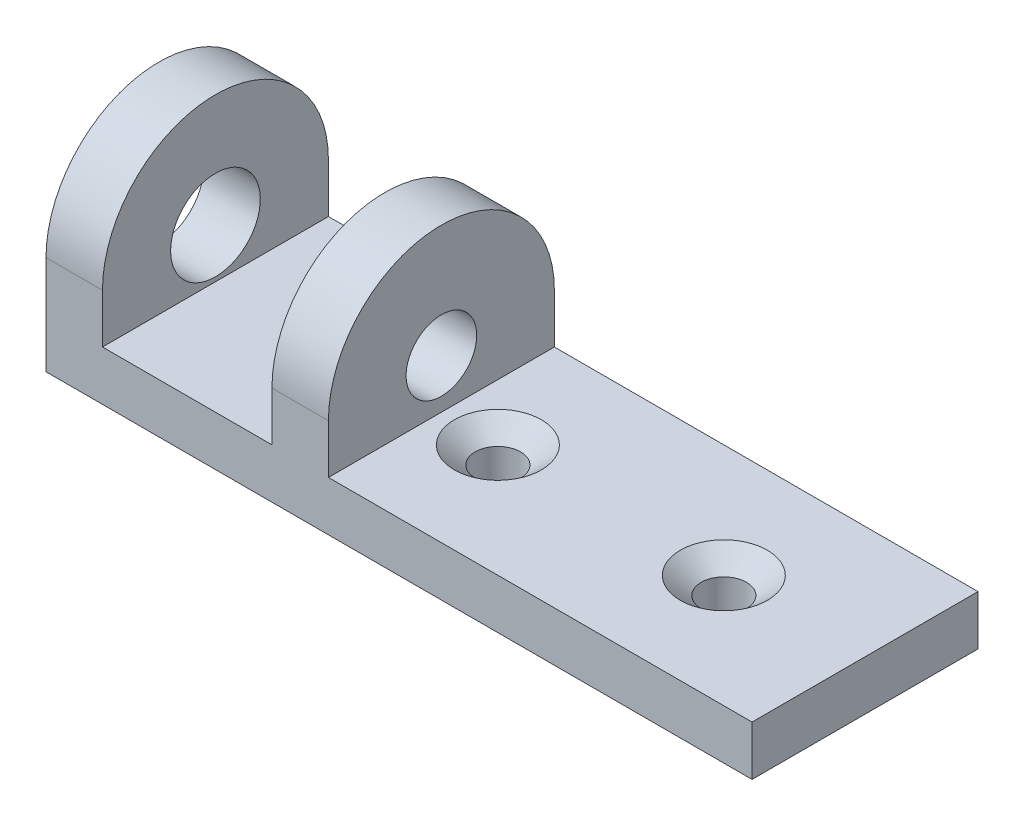
ISO-10303-21;
HEADER;
FILE_DESCRIPTION(('STEP AP214'),'2;1');
FILE_NAME('part.step','',(''),(''),'','','');
FILE_SCHEMA(('AUTOMOTIVE_DESIGN { 1 0 10303 214 1 1 1 1 }'));
ENDSEC;
DATA;
#1=APPLICATION_CONTEXT('core data for automotive mechanical design processes');
#2=APPLICATION_PROTOCOL_DEFINITION('international standard','automotive_design',2000,#1);
#3=PRODUCT_CONTEXT('',#1,'mechanical');
#4=PRODUCT('Part','Part','',(#3));
#5=PRODUCT_RELATED_PRODUCT_CATEGORY('part','',(#4));
#6=PRODUCT_DEFINITION_FORMATION('','',#4);
#7=PRODUCT_DEFINITION_CONTEXT('part definition',#1,'design');
#8=PRODUCT_DEFINITION('design','',#6,#7);
#9=PRODUCT_DEFINITION_SHAPE('','',#8);
#10=(LENGTH_UNIT() NAMED_UNIT(*) SI_UNIT(.MILLI.,.METRE.));
#11=(NAMED_UNIT(*) PLANE_ANGLE_UNIT() SI_UNIT($,.RADIAN.));
#12=(NAMED_UNIT(*) SI_UNIT($,.STERADIAN.) SOLID_ANGLE_UNIT());
#13=UNCERTAINTY_MEASURE_WITH_UNIT(LENGTH_MEASURE(1.E-05),#10,'distance_accuracy_value','');
#14=(GEOMETRIC_REPRESENTATION_CONTEXT(3) GLOBAL_UNCERTAINTY_ASSIGNED_CONTEXT((#13)) GLOBAL_UNIT_ASSIGNED_CONTEXT((#10,
#11,#12)) REPRESENTATION_CONTEXT('',''));
#15=CARTESIAN_POINT('',(0.,0.,0.));
#16=DIRECTION('',(0.,0.,1.));
#17=DIRECTION('',(1.,0.,0.));
#18=AXIS2_PLACEMENT_3D('',#15,#16,#17);
#19=CARTESIAN_POINT('',(6.34999999999999,12.7,-12.7));
#20=DIRECTION('',(-1.,0.,0.));
#21=DIRECTION('',(0.,-1.,0.));
#22=AXIS2_PLACEMENT_3D('',#19,#20,#21);
#23=PLANE('',#22);
#24=DIRECTION('',(0.,-1.,0.));
#25=VECTOR('',#24,1.);
#26=CARTESIAN_POINT('',(6.34999999999999,12.7,12.7));
#27=LINE('',#26,#25);
#28=CARTESIAN_POINT('',(6.35,0.,12.7));
#29=VERTEX_POINT('',#28);
#30=CARTESIAN_POINT('',(6.35,-5.5245,12.7));
#31=VERTEX_POINT('',#30);
#32=EDGE_CURVE('E117',#29,#31,#27,.T.);
#33=ORIENTED_EDGE('',*,*,#32,.T.);
#34=DIRECTION('',(0.,0.,1.));
#35=VECTOR('',#34,1.);
#36=CARTESIAN_POINT('',(6.35,-5.5245,-12.7));
#37=LINE('',#36,#35);
#38=CARTESIAN_POINT('',(6.35,-5.5245,-12.7));
#39=VERTEX_POINT('',#38);
#40=EDGE_CURVE('E110',#39,#31,#37,.T.);
#41=ORIENTED_EDGE('',*,*,#40,.F.);
#42=DIRECTION('',(0.,-1.,0.));
#43=VECTOR('',#42,1.);
#44=CARTESIAN_POINT('',(6.34999999999999,12.7,-12.7));
#45=LINE('',#44,#43);
#46=CARTESIAN_POINT('',(6.35,0.,-12.7));
#47=VERTEX_POINT('',#46);
#48=EDGE_CURVE('E114',#47,#39,#45,.T.);
#49=ORIENTED_EDGE('',*,*,#48,.F.);
#50=CARTESIAN_POINT('',(6.34999999999999,0.,0.));
#51=DIRECTION('',(-1.,0.,0.));
#52=DIRECTION('',(0.,-1.,0.));
#53=AXIS2_PLACEMENT_3D('',#50,#51,#52);
#54=CIRCLE('',#53,12.7);
#55=EDGE_CURVE('E161',#29,#47,#54,.T.);
#56=ORIENTED_EDGE('',*,*,#55,.F.);
#57=EDGE_LOOP('',(#33,#41,#49,#56));
#58=FACE_BOUND('',#57,.T.);
#59=CARTESIAN_POINT('',(6.35,0.,0.));
#60=DIRECTION('',(-1.,0.,0.));
#61=DIRECTION('',(0.,-1.,0.));
#62=AXIS2_PLACEMENT_3D('',#59,#60,#61);
#63=CIRCLE('',#62,5.0419);
#64=CARTESIAN_POINT('',(6.35,-5.0419,0.));
#65=VERTEX_POINT('',#64);
#66=EDGE_CURVE('E231',#65,#65,#63,.F.);
#67=ORIENTED_EDGE('',*,*,#66,.F.);
#68=EDGE_LOOP('',(#67));
#69=FACE_BOUND('',#68,.T.);
#70=ADVANCED_FACE('F32',(#58,#69),#23,.F.);
#71=CARTESIAN_POINT('',(25.4,12.7,-12.7));
#72=DIRECTION('',(1.,0.,0.));
#73=DIRECTION('',(0.,1.,0.));
#74=AXIS2_PLACEMENT_3D('',#71,#72,#73);
#75=PLANE('',#74);
#76=CARTESIAN_POINT('',(25.4,0.,0.));
#77=DIRECTION('',(1.,0.,0.));
#78=DIRECTION('',(0.,1.,0.));
#79=AXIS2_PLACEMENT_3D('',#76,#77,#78);
#80=CIRCLE('',#79,12.7);
#81=CARTESIAN_POINT('',(25.4,0.,-12.7));
#82=VERTEX_POINT('',#81);
#83=CARTESIAN_POINT('',(25.4,0.,12.7));
#84=VERTEX_POINT('',#83);
#85=EDGE_CURVE('E159',#82,#84,#80,.T.);
#86=ORIENTED_EDGE('',*,*,#85,.F.);
#87=DIRECTION('',(0.,1.,0.));
#88=VECTOR('',#87,1.);
#89=CARTESIAN_POINT('',(25.4,12.7,-12.7));
#90=LINE('',#89,#88);
#91=CARTESIAN_POINT('',(25.4,-5.5245,-12.7));
#92=VERTEX_POINT('',#91);
#93=EDGE_CURVE('E47',#92,#82,#90,.T.);
#94=ORIENTED_EDGE('',*,*,#93,.F.);
#95=DIRECTION('',(0.,0.,1.));
#96=VECTOR('',#95,1.);
#97=CARTESIAN_POINT('',(25.4,-5.5245,-12.7));
#98=LINE('',#97,#96);
#99=CARTESIAN_POINT('',(25.4,-5.5245,12.7));
#100=VERTEX_POINT('',#99);
#101=EDGE_CURVE('E121',#92,#100,#98,.T.);
#102=ORIENTED_EDGE('',*,*,#101,.T.);
#103=DIRECTION('',(0.,1.,0.));
#104=VECTOR('',#103,1.);
#105=CARTESIAN_POINT('',(25.4,12.7,12.7));
#106=LINE('',#105,#104);
#107=EDGE_CURVE('E131',#100,#84,#106,.T.);
#108=ORIENTED_EDGE('',*,*,#107,.T.);
#109=EDGE_LOOP('',(#86,#94,#102,#108));
#110=FACE_BOUND('',#109,.T.);
#111=CARTESIAN_POINT('',(25.4,0.,0.));
#112=DIRECTION('',(1.,0.,0.));
#113=DIRECTION('',(0.,1.,0.));
#114=AXIS2_PLACEMENT_3D('',#111,#112,#113);
#115=CIRCLE('',#114,3.96874999999999);
#116=CARTESIAN_POINT('',(25.4,3.96874999999999,0.));
#117=VERTEX_POINT('',#116);
#118=EDGE_CURVE('E222',#117,#117,#115,.F.);
#119=ORIENTED_EDGE('',*,*,#118,.F.);
#120=EDGE_LOOP('',(#119));
#121=FACE_BOUND('',#120,.T.);
#122=ADVANCED_FACE('F216',(#110,#121),#75,.F.);
#123=CARTESIAN_POINT('',(79.375,0.,0.));
#124=DIRECTION('',(-1.,0.,0.));
#125=DIRECTION('',(0.,0.,1.));
#126=AXIS2_PLACEMENT_3D('',#123,#124,#125);
#127=CYLINDRICAL_SURFACE('',#126,12.7);
#128=DIRECTION('',(-1.,0.,0.));
#129=VECTOR('',#128,1.);
#130=CARTESIAN_POINT('',(79.375,0.,12.7));
#131=LINE('',#130,#129);
#132=CARTESIAN_POINT('',(0.,0.,12.7));
#133=VERTEX_POINT('',#132);
#134=EDGE_CURVE('E36',#29,#133,#131,.T.);
#135=ORIENTED_EDGE('',*,*,#134,.F.);
#136=ORIENTED_EDGE('',*,*,#55,.T.);
#137=DIRECTION('',(-1.,0.,0.));
#138=VECTOR('',#137,1.);
#139=CARTESIAN_POINT('',(79.375,0.,-12.7));
#140=LINE('',#139,#138);
#141=CARTESIAN_POINT('',(0.,0.,-12.7));
#142=VERTEX_POINT('',#141);
#143=EDGE_CURVE('E130',#47,#142,#140,.T.);
#144=ORIENTED_EDGE('',*,*,#143,.T.);
#145=CARTESIAN_POINT('',(0.,0.,0.));
#146=DIRECTION('',(1.,0.,0.));
#147=DIRECTION('',(0.,0.,1.));
#148=AXIS2_PLACEMENT_3D('',#145,#146,#147);
#149=CIRCLE('',#148,12.7);
#150=EDGE_CURVE('E163',#142,#133,#149,.T.);
#151=ORIENTED_EDGE('',*,*,#150,.T.);
#152=EDGE_LOOP('',(#135,#136,#144,#151));
#153=FACE_BOUND('',#152,.T.);
#154=ADVANCED_FACE('F198',(#153),#127,.T.);
#155=CARTESIAN_POINT('',(79.375,0.,0.));
#156=DIRECTION('',(-1.,0.,0.));
#157=DIRECTION('',(0.,0.,1.));
#158=AXIS2_PLACEMENT_3D('',#155,#156,#157);
#159=PLANE('',#158);
#160=DIRECTION('',(0.,1.,0.));
#161=VECTOR('',#160,1.);
#162=CARTESIAN_POINT('',(79.375,-11.1125,-12.7));
#163=LINE('',#162,#161);
#164=CARTESIAN_POINT('',(79.375,-11.1125,-12.7));
#165=VERTEX_POINT('',#164);
#166=CARTESIAN_POINT('',(79.375,-5.5245,-12.7));
#167=VERTEX_POINT('',#166);
#168=EDGE_CURVE('E169',#165,#167,#163,.T.);
#169=ORIENTED_EDGE('',*,*,#168,.T.);
#170=DIRECTION('',(0.,0.,1.));
#171=VECTOR('',#170,1.);
#172=CARTESIAN_POINT('',(79.375,-5.5245,-12.7));
#173=LINE('',#172,#171);
#174=CARTESIAN_POINT('',(79.375,-5.5245,12.7));
#175=VERTEX_POINT('',#174);
#176=EDGE_CURVE('E55',#167,#175,#173,.T.);
#177=ORIENTED_EDGE('',*,*,#176,.T.);
#178=DIRECTION('',(0.,-1.,0.));
#179=VECTOR('',#178,1.);
#180=CARTESIAN_POINT('',(79.375,0.,12.7));
#181=LINE('',#180,#179);
#182=CARTESIAN_POINT('',(79.375,-11.1125,12.7));
#183=VERTEX_POINT('',#182);
#184=EDGE_CURVE('E164',#175,#183,#181,.T.);
#185=ORIENTED_EDGE('',*,*,#184,.T.);
#186=DIRECTION('',(0.,0.,-1.));
#187=VECTOR('',#186,1.);
#188=CARTESIAN_POINT('',(79.375,-11.1125,12.7));
#189=LINE('',#188,#187);
#190=EDGE_CURVE('E166',#183,#165,#189,.T.);
#191=ORIENTED_EDGE('',*,*,#190,.T.);
#192=EDGE_LOOP('',(#169,#177,#185,#191));
#193=FACE_BOUND('',#192,.T.);
#194=ADVANCED_FACE('F203',(#193),#159,.F.);
#195=CARTESIAN_POINT('',(0.,0.,0.));
#196=DIRECTION('',(-1.,0.,0.));
#197=DIRECTION('',(0.,0.,1.));
#198=AXIS2_PLACEMENT_3D('',#195,#196,#197);
#199=PLANE('',#198);
#200=CARTESIAN_POINT('',(0.,0.,0.));
#201=DIRECTION('',(-1.,0.,0.));
#202=DIRECTION('',(0.,0.,1.));
#203=AXIS2_PLACEMENT_3D('',#200,#201,#202);
#204=CIRCLE('',#203,5.0419);
#205=CARTESIAN_POINT('',(0.,0.,5.0419));
#206=VERTEX_POINT('',#205);
#207=EDGE_CURVE('E234',#206,#206,#204,.T.);
#208=ORIENTED_EDGE('',*,*,#207,.F.);
#209=EDGE_LOOP('',(#208));
#210=FACE_BOUND('',#209,.T.);
#211=ORIENTED_EDGE('',*,*,#150,.F.);
#212=DIRECTION('',(0.,1.,0.));
#213=VECTOR('',#212,1.);
#214=CARTESIAN_POINT('',(0.,-11.1125,-12.7));
#215=LINE('',#214,#213);
#216=CARTESIAN_POINT('',(0.,-11.1125,-12.7));
#217=VERTEX_POINT('',#216);
#218=EDGE_CURVE('E167',#217,#142,#215,.T.);
#219=ORIENTED_EDGE('',*,*,#218,.F.);
#220=DIRECTION('',(0.,0.,-1.));
#221=VECTOR('',#220,1.);
#222=CARTESIAN_POINT('',(0.,-11.1125,12.7));
#223=LINE('',#222,#221);
#224=CARTESIAN_POINT('',(0.,-11.1125,12.7));
#225=VERTEX_POINT('',#224);
#226=EDGE_CURVE('E176',#225,#217,#223,.T.);
#227=ORIENTED_EDGE('',*,*,#226,.F.);
#228=DIRECTION('',(0.,-1.,0.));
#229=VECTOR('',#228,1.);
#230=CARTESIAN_POINT('',(0.,0.,12.7));
#231=LINE('',#230,#229);
#232=EDGE_CURVE('E174',#133,#225,#231,.T.);
#233=ORIENTED_EDGE('',*,*,#232,.F.);
#234=EDGE_LOOP('',(#211,#219,#227,#233));
#235=FACE_BOUND('',#234,.T.);
#236=ADVANCED_FACE('F196',(#210,#235),#199,.T.);
#237=ORIENTED_EDGE('',*,*,#85,.T.);
#238=CARTESIAN_POINT('',(31.75,0.,12.7));
#239=VERTEX_POINT('',#238);
#240=EDGE_CURVE('E11',#239,#84,#131,.T.);
#241=ORIENTED_EDGE('',*,*,#240,.F.);
#242=CARTESIAN_POINT('',(31.75,0.,0.));
#243=DIRECTION('',(-1.,0.,0.));
#244=DIRECTION('',(0.,0.,1.));
#245=AXIS2_PLACEMENT_3D('',#242,#243,#244);
#246=CIRCLE('',#245,12.7);
#247=CARTESIAN_POINT('',(31.75,0.,-12.7));
#248=VERTEX_POINT('',#247);
#249=EDGE_CURVE('E143',#239,#248,#246,.T.);
#250=ORIENTED_EDGE('',*,*,#249,.T.);
#251=EDGE_CURVE('E180',#248,#82,#140,.T.);
#252=ORIENTED_EDGE('',*,*,#251,.T.);
#253=EDGE_LOOP('',(#237,#241,#250,#252));
#254=FACE_BOUND('',#253,.T.);
#255=ADVANCED_FACE('F34',(#254),#127,.T.);
#256=CARTESIAN_POINT('',(79.375,0.,12.7));
#257=DIRECTION('',(0.,0.,-1.));
#258=DIRECTION('',(-1.,0.,0.));
#259=AXIS2_PLACEMENT_3D('',#256,#257,#258);
#260=PLANE('',#259);
#261=DIRECTION('',(1.,0.,0.));
#262=VECTOR('',#261,1.);
#263=CARTESIAN_POINT('',(6.35,-5.5245,12.7));
#264=LINE('',#263,#262);
#265=EDGE_CURVE('E134',#31,#100,#264,.T.);
#266=ORIENTED_EDGE('',*,*,#265,.F.);
#267=ORIENTED_EDGE('',*,*,#32,.F.);
#268=ORIENTED_EDGE('',*,*,#134,.T.);
#269=ORIENTED_EDGE('',*,*,#232,.T.);
#270=DIRECTION('',(-1.,0.,0.));
#271=VECTOR('',#270,1.);
#272=CARTESIAN_POINT('',(79.375,-11.1125,12.7));
#273=LINE('',#272,#271);
#274=EDGE_CURVE('E183',#183,#225,#273,.T.);
#275=ORIENTED_EDGE('',*,*,#274,.F.);
#276=ORIENTED_EDGE('',*,*,#184,.F.);
#277=DIRECTION('',(1.,0.,0.));
#278=VECTOR('',#277,1.);
#279=CARTESIAN_POINT('',(31.75,-5.5245,12.7));
#280=LINE('',#279,#278);
#281=CARTESIAN_POINT('',(31.75,-5.5245,12.7));
#282=VERTEX_POINT('',#281);
#283=EDGE_CURVE('E149',#282,#175,#280,.T.);
#284=ORIENTED_EDGE('',*,*,#283,.F.);
#285=DIRECTION('',(0.,-1.,0.));
#286=VECTOR('',#285,1.);
#287=CARTESIAN_POINT('',(31.75,12.7,12.7));
#288=LINE('',#287,#286);
#289=EDGE_CURVE('E152',#239,#282,#288,.T.);
#290=ORIENTED_EDGE('',*,*,#289,.F.);
#291=ORIENTED_EDGE('',*,*,#240,.T.);
#292=ORIENTED_EDGE('',*,*,#107,.F.);
#293=EDGE_LOOP('',(#266,#267,#268,#269,#275,#276,#284,#290,#291,#292));
#294=FACE_BOUND('',#293,.T.);
#295=ADVANCED_FACE('F192',(#294),#260,.F.);
#296=CARTESIAN_POINT('',(79.375,-11.1125,12.7));
#297=DIRECTION('',(0.,1.,0.));
#298=DIRECTION('',(0.,0.,1.));
#299=AXIS2_PLACEMENT_3D('',#296,#297,#298);
#300=PLANE('',#299);
#301=CARTESIAN_POINT('',(63.5,-11.1125,0.));
#302=DIRECTION('',(0.,1.,0.));
#303=DIRECTION('',(0.,0.,1.));
#304=AXIS2_PLACEMENT_3D('',#301,#302,#303);
#305=CIRCLE('',#304,2.55270000000001);
#306=CARTESIAN_POINT('',(63.5,-11.1125,2.55270000000001));
#307=VERTEX_POINT('',#306);
#308=EDGE_CURVE('E239',#307,#307,#305,.T.);
#309=ORIENTED_EDGE('',*,*,#308,.T.);
#310=EDGE_LOOP('',(#309));
#311=FACE_BOUND('',#310,.T.);
#312=CARTESIAN_POINT('',(38.1,-11.1125,0.));
#313=DIRECTION('',(0.,1.,0.));
#314=DIRECTION('',(0.,0.,1.));
#315=AXIS2_PLACEMENT_3D('',#312,#313,#314);
#316=CIRCLE('',#315,2.5527);
#317=CARTESIAN_POINT('',(38.1,-11.1125,2.5527));
#318=VERTEX_POINT('',#317);
#319=EDGE_CURVE('E137',#318,#318,#316,.T.);
#320=ORIENTED_EDGE('',*,*,#319,.T.);
#321=EDGE_LOOP('',(#320));
#322=FACE_BOUND('',#321,.T.);
#323=ORIENTED_EDGE('',*,*,#226,.T.);
#324=DIRECTION('',(-1.,0.,0.));
#325=VECTOR('',#324,1.);
#326=CARTESIAN_POINT('',(79.375,-11.1125,-12.7));
#327=LINE('',#326,#325);
#328=EDGE_CURVE('E181',#165,#217,#327,.T.);
#329=ORIENTED_EDGE('',*,*,#328,.F.);
#330=ORIENTED_EDGE('',*,*,#190,.F.);
#331=ORIENTED_EDGE('',*,*,#274,.T.);
#332=EDGE_LOOP('',(#323,#329,#330,#331));
#333=FACE_BOUND('',#332,.T.);
#334=ADVANCED_FACE('F201',(#311,#322,#333),#300,.F.);
#335=CARTESIAN_POINT('',(79.375,-11.1125,-12.7));
#336=DIRECTION('',(0.,0.,1.));
#337=DIRECTION('',(0.,-1.,0.));
#338=AXIS2_PLACEMENT_3D('',#335,#336,#337);
#339=PLANE('',#338);
#340=ORIENTED_EDGE('',*,*,#143,.F.);
#341=ORIENTED_EDGE('',*,*,#48,.T.);
#342=DIRECTION('',(1.,0.,0.));
#343=VECTOR('',#342,1.);
#344=CARTESIAN_POINT('',(6.35,-5.5245,-12.7));
#345=LINE('',#344,#343);
#346=EDGE_CURVE('E124',#39,#92,#345,.T.);
#347=ORIENTED_EDGE('',*,*,#346,.T.);
#348=ORIENTED_EDGE('',*,*,#93,.T.);
#349=ORIENTED_EDGE('',*,*,#251,.F.);
#350=DIRECTION('',(0.,-1.,0.));
#351=VECTOR('',#350,1.);
#352=CARTESIAN_POINT('',(31.75,12.7,-12.7));
#353=LINE('',#352,#351);
#354=CARTESIAN_POINT('',(31.75,-5.5245,-12.7));
#355=VERTEX_POINT('',#354);
#356=EDGE_CURVE('E145',#248,#355,#353,.T.);
#357=ORIENTED_EDGE('',*,*,#356,.T.);
#358=DIRECTION('',(1.,0.,0.));
#359=VECTOR('',#358,1.);
#360=CARTESIAN_POINT('',(31.75,-5.5245,-12.7));
#361=LINE('',#360,#359);
#362=EDGE_CURVE('E148',#355,#167,#361,.T.);
#363=ORIENTED_EDGE('',*,*,#362,.T.);
#364=ORIENTED_EDGE('',*,*,#168,.F.);
#365=ORIENTED_EDGE('',*,*,#328,.T.);
#366=ORIENTED_EDGE('',*,*,#218,.T.);
#367=EDGE_LOOP('',(#340,#341,#347,#348,#349,#357,#363,#364,#365,#366));
#368=FACE_BOUND('',#367,.T.);
#369=ADVANCED_FACE('F128',(#368),#339,.F.);
#370=CARTESIAN_POINT('',(31.75,12.7,-12.7));
#371=DIRECTION('',(-1.,0.,0.));
#372=DIRECTION('',(0.,0.,1.));
#373=AXIS2_PLACEMENT_3D('',#370,#371,#372);
#374=PLANE('',#373);
#375=CARTESIAN_POINT('',(31.75,0.,0.));
#376=DIRECTION('',(1.,0.,0.));
#377=DIRECTION('',(0.,0.,-1.));
#378=AXIS2_PLACEMENT_3D('',#375,#376,#377);
#379=CIRCLE('',#378,3.96874999999999);
#380=CARTESIAN_POINT('',(31.75,0.,-3.96874999999999));
#381=VERTEX_POINT('',#380);
#382=EDGE_CURVE('E225',#381,#381,#379,.T.);
#383=ORIENTED_EDGE('',*,*,#382,.F.);
#384=EDGE_LOOP('',(#383));
#385=FACE_BOUND('',#384,.T.);
#386=ORIENTED_EDGE('',*,*,#289,.T.);
#387=DIRECTION('',(0.,0.,1.));
#388=VECTOR('',#387,1.);
#389=CARTESIAN_POINT('',(31.75,-5.5245,-12.7));
#390=LINE('',#389,#388);
#391=EDGE_CURVE('E151',#355,#282,#390,.T.);
#392=ORIENTED_EDGE('',*,*,#391,.F.);
#393=ORIENTED_EDGE('',*,*,#356,.F.);
#394=ORIENTED_EDGE('',*,*,#249,.F.);
#395=EDGE_LOOP('',(#386,#392,#393,#394));
#396=FACE_BOUND('',#395,.T.);
#397=ADVANCED_FACE('F211',(#385,#396),#374,.F.);
#398=CARTESIAN_POINT('',(31.75,-5.5245,-12.7));
#399=DIRECTION('',(0.,-1.,0.));
#400=DIRECTION('',(0.,0.,-1.));
#401=AXIS2_PLACEMENT_3D('',#398,#399,#400);
#402=PLANE('',#401);
#403=CARTESIAN_POINT('',(63.5,-5.5245,0.));
#404=DIRECTION('',(0.,1.,0.));
#405=DIRECTION('',(0.,0.,1.));
#406=AXIS2_PLACEMENT_3D('',#403,#404,#405);
#407=CIRCLE('',#406,4.88950000000001);
#408=CARTESIAN_POINT('',(63.5,-5.5245,4.88950000000001));
#409=VERTEX_POINT('',#408);
#410=EDGE_CURVE('E224',#409,#409,#407,.T.);
#411=ORIENTED_EDGE('',*,*,#410,.F.);
#412=EDGE_LOOP('',(#411));
#413=FACE_BOUND('',#412,.T.);
#414=CARTESIAN_POINT('',(38.1,-5.5245,0.));
#415=DIRECTION('',(0.,1.,0.));
#416=DIRECTION('',(0.,0.,1.));
#417=AXIS2_PLACEMENT_3D('',#414,#415,#416);
#418=CIRCLE('',#417,4.8895);
#419=CARTESIAN_POINT('',(38.1,-5.5245,4.8895));
#420=VERTEX_POINT('',#419);
#421=EDGE_CURVE('E242',#420,#420,#418,.T.);
#422=ORIENTED_EDGE('',*,*,#421,.F.);
#423=EDGE_LOOP('',(#422));
#424=FACE_BOUND('',#423,.T.);
#425=ORIENTED_EDGE('',*,*,#283,.T.);
#426=ORIENTED_EDGE('',*,*,#176,.F.);
#427=ORIENTED_EDGE('',*,*,#362,.F.);
#428=ORIENTED_EDGE('',*,*,#391,.T.);
#429=EDGE_LOOP('',(#425,#426,#427,#428));
#430=FACE_BOUND('',#429,.T.);
#431=ADVANCED_FACE('F208',(#413,#424,#430),#402,.F.);
#432=CARTESIAN_POINT('',(6.35,-5.5245,-12.7));
#433=DIRECTION('',(0.,-1.,0.));
#434=DIRECTION('',(0.,0.,-1.));
#435=AXIS2_PLACEMENT_3D('',#432,#433,#434);
#436=PLANE('',#435);
#437=ORIENTED_EDGE('',*,*,#265,.T.);
#438=ORIENTED_EDGE('',*,*,#101,.F.);
#439=ORIENTED_EDGE('',*,*,#346,.F.);
#440=ORIENTED_EDGE('',*,*,#40,.T.);
#441=EDGE_LOOP('',(#437,#438,#439,#440));
#442=FACE_BOUND('',#441,.T.);
#443=ADVANCED_FACE('F125',(#442),#436,.F.);
#444=CARTESIAN_POINT('',(38.1,-5.5245,0.));
#445=DIRECTION('',(0.,1.,0.));
#446=DIRECTION('',(0.,0.,1.));
#447=AXIS2_PLACEMENT_3D('',#444,#445,#446);
#448=CYLINDRICAL_SURFACE('',#447,2.5527);
#449=ORIENTED_EDGE('',*,*,#319,.F.);
#450=EDGE_LOOP('',(#449));
#451=FACE_BOUND('',#450,.T.);
#452=CARTESIAN_POINT('',(38.1,-7.48530801813507,0.));
#453=DIRECTION('',(0.,1.,0.));
#454=DIRECTION('',(0.,0.,1.));
#455=AXIS2_PLACEMENT_3D('',#452,#453,#454);
#456=CIRCLE('',#455,2.5527);
#457=CARTESIAN_POINT('',(38.1,-7.48530801813507,2.5527));
#458=VERTEX_POINT('',#457);
#459=EDGE_CURVE('E244',#458,#458,#456,.T.);
#460=ORIENTED_EDGE('',*,*,#459,.T.);
#461=EDGE_LOOP('',(#460));
#462=FACE_BOUND('',#461,.T.);
#463=ADVANCED_FACE('F252',(#451,#462),#448,.F.);
#464=CARTESIAN_POINT('',(38.1,-5.5245,0.));
#465=DIRECTION('',(0.,1.,0.));
#466=DIRECTION('',(0.,0.,1.));
#467=AXIS2_PLACEMENT_3D('',#464,#465,#466);
#468=CONICAL_SURFACE('',#467,4.8895,0.872664625997164);
#469=ORIENTED_EDGE('',*,*,#459,.F.);
#470=EDGE_LOOP('',(#469));
#471=FACE_BOUND('',#470,.T.);
#472=ORIENTED_EDGE('',*,*,#421,.T.);
#473=EDGE_LOOP('',(#472));
#474=FACE_BOUND('',#473,.T.);
#475=ADVANCED_FACE('F254',(#471,#474),#468,.F.);
#476=CARTESIAN_POINT('',(63.5,-5.5245,0.));
#477=DIRECTION('',(0.,1.,0.));
#478=DIRECTION('',(0.,0.,1.));
#479=AXIS2_PLACEMENT_3D('',#476,#477,#478);
#480=CYLINDRICAL_SURFACE('',#479,2.55270000000001);
#481=ORIENTED_EDGE('',*,*,#308,.F.);
#482=EDGE_LOOP('',(#481));
#483=FACE_BOUND('',#482,.T.);
#484=CARTESIAN_POINT('',(63.5,-7.48530801813507,0.));
#485=DIRECTION('',(0.,1.,0.));
#486=DIRECTION('',(0.,0.,1.));
#487=AXIS2_PLACEMENT_3D('',#484,#485,#486);
#488=CIRCLE('',#487,2.55270000000001);
#489=CARTESIAN_POINT('',(63.5,-7.48530801813507,2.55270000000001));
#490=VERTEX_POINT('',#489);
#491=EDGE_CURVE('E228',#490,#490,#488,.T.);
#492=ORIENTED_EDGE('',*,*,#491,.T.);
#493=EDGE_LOOP('',(#492));
#494=FACE_BOUND('',#493,.T.);
#495=ADVANCED_FACE('F260',(#483,#494),#480,.F.);
#496=CARTESIAN_POINT('',(63.5,-5.5245,0.));
#497=DIRECTION('',(0.,1.,0.));
#498=DIRECTION('',(0.,0.,1.));
#499=AXIS2_PLACEMENT_3D('',#496,#497,#498);
#500=CONICAL_SURFACE('',#499,4.88950000000001,0.872664625997164);
#501=ORIENTED_EDGE('',*,*,#491,.F.);
#502=EDGE_LOOP('',(#501));
#503=FACE_BOUND('',#502,.T.);
#504=ORIENTED_EDGE('',*,*,#410,.T.);
#505=EDGE_LOOP('',(#504));
#506=FACE_BOUND('',#505,.T.);
#507=ADVANCED_FACE('F325',(#503,#506),#500,.F.);
#508=CARTESIAN_POINT('',(31.75,0.,0.));
#509=DIRECTION('',(1.,0.,0.));
#510=DIRECTION('',(0.,0.,-1.));
#511=AXIS2_PLACEMENT_3D('',#508,#509,#510);
#512=CYLINDRICAL_SURFACE('',#511,3.96874999999999);
#513=ORIENTED_EDGE('',*,*,#118,.T.);
#514=EDGE_LOOP('',(#513));
#515=FACE_BOUND('',#514,.T.);
#516=ORIENTED_EDGE('',*,*,#382,.T.);
#517=EDGE_LOOP('',(#516));
#518=FACE_BOUND('',#517,.T.);
#519=ADVANCED_FACE('F316',(#515,#518),#512,.F.);
#520=CARTESIAN_POINT('',(0.,0.,0.));
#521=DIRECTION('',(-1.,0.,0.));
#522=DIRECTION('',(0.,0.,1.));
#523=AXIS2_PLACEMENT_3D('',#520,#521,#522);
#524=CYLINDRICAL_SURFACE('',#523,5.0419);
#525=ORIENTED_EDGE('',*,*,#66,.T.);
#526=EDGE_LOOP('',(#525));
#527=FACE_BOUND('',#526,.T.);
#528=ORIENTED_EDGE('',*,*,#207,.T.);
#529=EDGE_LOOP('',(#528));
#530=FACE_BOUND('',#529,.T.);
#531=ADVANCED_FACE('F312',(#527,#530),#524,.F.);
#532=CLOSED_SHELL('',(#70,#122,#154,#194,#236,#255,#295,#334,#369,#397,#431,#443,#463,#475,#495,
#507,#519,#531));
#533=MANIFOLD_SOLID_BREP('B2',#532);
#534=ADVANCED_BREP_SHAPE_REPRESENTATION('',(#18,#533),#14);
#535=SHAPE_DEFINITION_REPRESENTATION(#9,#534);
ENDSEC;
END-ISO-10303-21;
